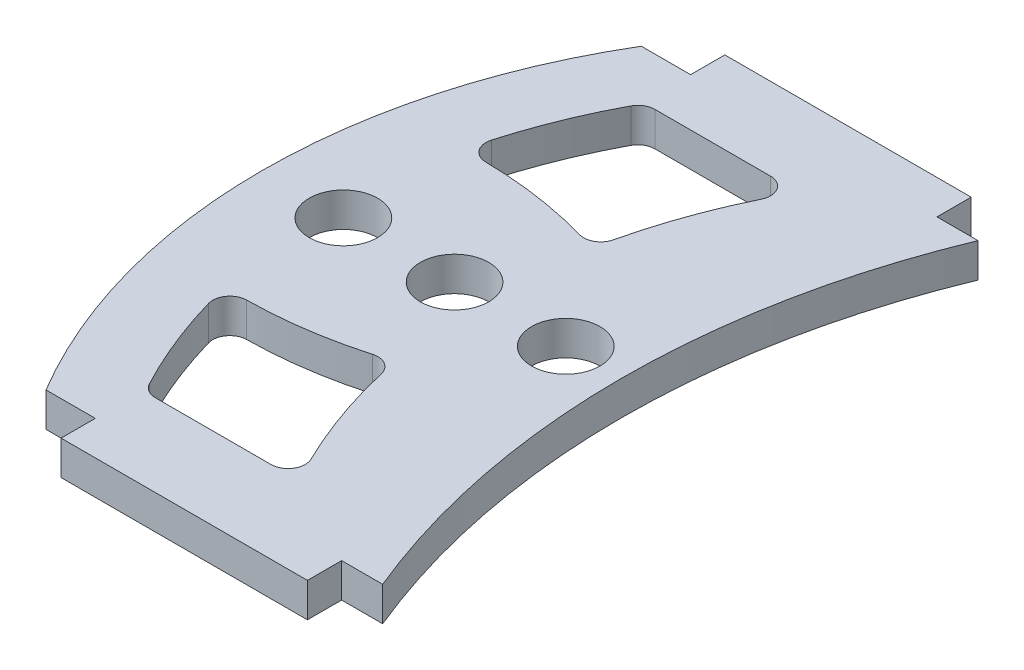
ISO-10303-21;
HEADER;
FILE_DESCRIPTION(('STEP AP214'),'2;1');
FILE_NAME('part.step','',(''),(''),'','','');
FILE_SCHEMA(('AUTOMOTIVE_DESIGN { 1 0 10303 214 1 1 1 1 }'));
ENDSEC;
DATA;
#1=APPLICATION_CONTEXT('core data for automotive mechanical design processes');
#2=APPLICATION_PROTOCOL_DEFINITION('international standard','automotive_design',2000,#1);
#3=PRODUCT_CONTEXT('',#1,'mechanical');
#4=PRODUCT('Part','Part','',(#3));
#5=PRODUCT_RELATED_PRODUCT_CATEGORY('part','',(#4));
#6=PRODUCT_DEFINITION_FORMATION('','',#4);
#7=PRODUCT_DEFINITION_CONTEXT('part definition',#1,'design');
#8=PRODUCT_DEFINITION('design','',#6,#7);
#9=PRODUCT_DEFINITION_SHAPE('','',#8);
#10=(LENGTH_UNIT() NAMED_UNIT(*) SI_UNIT(.MILLI.,.METRE.));
#11=(NAMED_UNIT(*) PLANE_ANGLE_UNIT() SI_UNIT($,.RADIAN.));
#12=(NAMED_UNIT(*) SI_UNIT($,.STERADIAN.) SOLID_ANGLE_UNIT());
#13=UNCERTAINTY_MEASURE_WITH_UNIT(LENGTH_MEASURE(1.E-05),#10,'distance_accuracy_value','');
#14=(GEOMETRIC_REPRESENTATION_CONTEXT(3) GLOBAL_UNCERTAINTY_ASSIGNED_CONTEXT((#13)) GLOBAL_UNIT_ASSIGNED_CONTEXT((#10,
#11,#12)) REPRESENTATION_CONTEXT('',''));
#15=CARTESIAN_POINT('',(0.,0.,0.));
#16=DIRECTION('',(0.,0.,1.));
#17=DIRECTION('',(1.,0.,0.));
#18=AXIS2_PLACEMENT_3D('',#15,#16,#17);
#19=CARTESIAN_POINT('',(37.1716857379459,2.,-20.9983589152019));
#20=DIRECTION('',(0.,1.,0.));
#21=DIRECTION('',(0.,0.,1.));
#22=AXIS2_PLACEMENT_3D('',#19,#20,#21);
#23=PLANE('',#22);
#24=CARTESIAN_POINT('',(7.94517783956323,2.,-20.9983589152019));
#25=DIRECTION('',(0.,1.,0.));
#26=DIRECTION('',(0.,0.,1.));
#27=AXIS2_PLACEMENT_3D('',#24,#25,#26);
#28=CIRCLE('',#27,2.);
#29=CARTESIAN_POINT('',(7.94517783956323,2.,-18.9983589152019));
#30=VERTEX_POINT('',#29);
#31=EDGE_CURVE('E349',#30,#30,#28,.T.);
#32=ORIENTED_EDGE('',*,*,#31,.F.);
#33=EDGE_LOOP('',(#32));
#34=FACE_BOUND('',#33,.T.);
#35=CARTESIAN_POINT('',(37.1716857379459,2.,-20.9983589152019));
#36=DIRECTION('',(0.,1.,0.));
#37=DIRECTION('',(0.,0.,1.));
#38=AXIS2_PLACEMENT_3D('',#35,#36,#37);
#39=CIRCLE('',#38,34.);
#40=CARTESIAN_POINT('',(7.96141357214785,2.,-38.3983589152019));
#41=VERTEX_POINT('',#40);
#42=CARTESIAN_POINT('',(7.96141357214785,2.,-3.59835891520195));
#43=VERTEX_POINT('',#42);
#44=EDGE_CURVE('E361',#41,#43,#39,.T.);
#45=ORIENTED_EDGE('',*,*,#44,.T.);
#46=DIRECTION('',(1.,0.,0.));
#47=VECTOR('',#46,1.);
#48=CARTESIAN_POINT('',(10.8429336929978,2.,-3.59835891520195));
#49=LINE('',#48,#47);
#50=CARTESIAN_POINT('',(10.8429336929978,2.,-3.59835891520195));
#51=VERTEX_POINT('',#50);
#52=EDGE_CURVE('E364',#43,#51,#49,.T.);
#53=ORIENTED_EDGE('',*,*,#52,.T.);
#54=DIRECTION('',(0.,0.,1.));
#55=VECTOR('',#54,1.);
#56=CARTESIAN_POINT('',(10.8429336929978,2.,-1.59835891520192));
#57=LINE('',#56,#55);
#58=CARTESIAN_POINT('',(10.8429336929978,2.,-1.59835891520192));
#59=VERTEX_POINT('',#58);
#60=EDGE_CURVE('E367',#51,#59,#57,.T.);
#61=ORIENTED_EDGE('',*,*,#60,.T.);
#62=DIRECTION('',(1.,0.,0.));
#63=VECTOR('',#62,1.);
#64=CARTESIAN_POINT('',(25.2429336929978,2.,-1.59835891520192));
#65=LINE('',#64,#63);
#66=CARTESIAN_POINT('',(25.2429336929978,2.,-1.59835891520192));
#67=VERTEX_POINT('',#66);
#68=EDGE_CURVE('E369',#59,#67,#65,.T.);
#69=ORIENTED_EDGE('',*,*,#68,.T.);
#70=DIRECTION('',(0.,0.,-1.));
#71=VECTOR('',#70,1.);
#72=CARTESIAN_POINT('',(25.2429336929978,2.,-3.59835891520192));
#73=LINE('',#72,#71);
#74=CARTESIAN_POINT('',(25.2429336929978,2.,-3.59835891520192));
#75=VERTEX_POINT('',#74);
#76=EDGE_CURVE('E371',#67,#75,#73,.T.);
#77=ORIENTED_EDGE('',*,*,#76,.T.);
#78=DIRECTION('',(1.,0.,0.));
#79=VECTOR('',#78,1.);
#80=CARTESIAN_POINT('',(27.6430126076578,2.,-3.59835891520195));
#81=LINE('',#80,#79);
#82=CARTESIAN_POINT('',(27.6430126076578,2.,-3.59835891520197));
#83=VERTEX_POINT('',#82);
#84=EDGE_CURVE('E373',#75,#83,#81,.T.);
#85=ORIENTED_EDGE('',*,*,#84,.T.);
#86=CARTESIAN_POINT('',(69.7927457028982,2.,-20.9983589152019));
#87=DIRECTION('',(0.,-1.,0.));
#88=DIRECTION('',(0.,0.,1.));
#89=AXIS2_PLACEMENT_3D('',#86,#87,#88);
#90=CIRCLE('',#89,45.6);
#91=CARTESIAN_POINT('',(27.6430126076579,2.,-38.398358915202));
#92=VERTEX_POINT('',#91);
#93=EDGE_CURVE('E375',#83,#92,#90,.T.);
#94=ORIENTED_EDGE('',*,*,#93,.T.);
#95=DIRECTION('',(-1.,0.,0.));
#96=VECTOR('',#95,1.);
#97=CARTESIAN_POINT('',(25.2429336929978,2.,-38.398358915202));
#98=LINE('',#97,#96);
#99=CARTESIAN_POINT('',(25.2429336929978,2.,-38.398358915202));
#100=VERTEX_POINT('',#99);
#101=EDGE_CURVE('E377',#92,#100,#98,.T.);
#102=ORIENTED_EDGE('',*,*,#101,.T.);
#103=DIRECTION('',(0.,0.,-1.));
#104=VECTOR('',#103,1.);
#105=CARTESIAN_POINT('',(25.2429336929978,2.,-40.3983589152019));
#106=LINE('',#105,#104);
#107=CARTESIAN_POINT('',(25.2429336929978,2.,-40.3983589152019));
#108=VERTEX_POINT('',#107);
#109=EDGE_CURVE('E379',#100,#108,#106,.T.);
#110=ORIENTED_EDGE('',*,*,#109,.T.);
#111=DIRECTION('',(-1.,0.,0.));
#112=VECTOR('',#111,1.);
#113=CARTESIAN_POINT('',(10.8429336929978,2.,-40.3983589152019));
#114=LINE('',#113,#112);
#115=CARTESIAN_POINT('',(10.8429336929978,2.,-40.3983589152019));
#116=VERTEX_POINT('',#115);
#117=EDGE_CURVE('E381',#108,#116,#114,.T.);
#118=ORIENTED_EDGE('',*,*,#117,.T.);
#119=DIRECTION('',(0.,0.,1.));
#120=VECTOR('',#119,1.);
#121=CARTESIAN_POINT('',(10.8429336929978,2.,-38.3983589152019));
#122=LINE('',#121,#120);
#123=CARTESIAN_POINT('',(10.8429336929978,2.,-38.3983589152019));
#124=VERTEX_POINT('',#123);
#125=EDGE_CURVE('E383',#116,#124,#122,.T.);
#126=ORIENTED_EDGE('',*,*,#125,.T.);
#127=DIRECTION('',(-1.,0.,0.));
#128=VECTOR('',#127,1.);
#129=CARTESIAN_POINT('',(7.96141357214785,2.,-38.3983589152019));
#130=LINE('',#129,#128);
#131=EDGE_CURVE('E385',#124,#41,#130,.T.);
#132=ORIENTED_EDGE('',*,*,#131,.T.);
#133=EDGE_LOOP('',(#45,#53,#61,#69,#77,#85,#94,#102,#110,#118,#126,#132));
#134=FACE_BOUND('',#133,.T.);
#135=CARTESIAN_POINT('',(14.4451778395632,2.,-20.9983589152019));
#136=DIRECTION('',(0.,1.,0.));
#137=DIRECTION('',(0.,0.,1.));
#138=AXIS2_PLACEMENT_3D('',#135,#136,#137);
#139=CIRCLE('',#138,2.);
#140=CARTESIAN_POINT('',(14.4451778395632,2.,-18.9983589152019));
#141=VERTEX_POINT('',#140);
#142=EDGE_CURVE('E355',#141,#141,#139,.T.);
#143=ORIENTED_EDGE('',*,*,#142,.F.);
#144=EDGE_LOOP('',(#143));
#145=FACE_BOUND('',#144,.T.);
#146=CARTESIAN_POINT('',(20.9451778395632,2.,-20.9983589152019));
#147=DIRECTION('',(0.,1.,0.));
#148=DIRECTION('',(0.,0.,1.));
#149=AXIS2_PLACEMENT_3D('',#146,#147,#148);
#150=CIRCLE('',#149,2.);
#151=CARTESIAN_POINT('',(20.9451778395632,2.,-18.9983589152019));
#152=VERTEX_POINT('',#151);
#153=EDGE_CURVE('E343',#152,#152,#150,.T.);
#154=ORIENTED_EDGE('',*,*,#153,.F.);
#155=EDGE_LOOP('',(#154));
#156=FACE_BOUND('',#155,.T.);
#157=CARTESIAN_POINT('',(11.5584079313083,2.,-7.39835891520193));
#158=DIRECTION('',(0.,1.,0.));
#159=DIRECTION('',(0.,0.,1.));
#160=AXIS2_PLACEMENT_3D('',#157,#158,#159);
#161=CIRCLE('',#160,1.00000000000003);
#162=CARTESIAN_POINT('',(10.6751914552173,2.,-6.92939339796053));
#163=VERTEX_POINT('',#162);
#164=CARTESIAN_POINT('',(11.5584079313083,2.,-6.3983589152019));
#165=VERTEX_POINT('',#164);
#166=EDGE_CURVE('E286',#163,#165,#161,.T.);
#167=ORIENTED_EDGE('',*,*,#166,.F.);
#168=CARTESIAN_POINT('',(37.1716857379459,2.,-20.9983589152019));
#169=DIRECTION('',(0.,1.,0.));
#170=DIRECTION('',(0.,0.,1.));
#171=AXIS2_PLACEMENT_3D('',#168,#169,#170);
#172=CIRCLE('',#171,30.);
#173=CARTESIAN_POINT('',(8.33179263701058,2.,-12.7363636400509));
#174=VERTEX_POINT('',#173);
#175=EDGE_CURVE('E284',#174,#163,#172,.T.);
#176=ORIENTED_EDGE('',*,*,#175,.F.);
#177=CARTESIAN_POINT('',(9.29312240704176,2.,-13.011763482556));
#178=DIRECTION('',(0.,1.,0.));
#179=DIRECTION('',(0.,0.,1.));
#180=AXIS2_PLACEMENT_3D('',#177,#178,#179);
#181=CIRCLE('',#180,1.);
#182=CARTESIAN_POINT('',(9.28161476425723,2.,-14.0116972674425));
#183=VERTEX_POINT('',#182);
#184=EDGE_CURVE('E300',#183,#174,#181,.T.);
#185=ORIENTED_EDGE('',*,*,#184,.F.);
#186=CARTESIAN_POINT('',(8.99980254155067,2.,-38.4992111531441));
#187=DIRECTION('',(0.,-1.,0.));
#188=DIRECTION('',(0.,0.,1.));
#189=AXIS2_PLACEMENT_3D('',#186,#187,#188);
#190=CIRCLE('',#189,24.4891354365828);
#191=CARTESIAN_POINT('',(15.7021599410508,2.,-14.9450998406649));
#192=VERTEX_POINT('',#191);
#193=EDGE_CURVE('E297',#192,#183,#190,.T.);
#194=ORIENTED_EDGE('',*,*,#193,.F.);
#195=CARTESIAN_POINT('',(15.975846916112,2.,-13.9832810221331));
#196=DIRECTION('',(0.,1.,0.));
#197=DIRECTION('',(0.,0.,1.));
#198=AXIS2_PLACEMENT_3D('',#195,#196,#197);
#199=CIRCLE('',#198,0.999999999999995);
#200=CARTESIAN_POINT('',(16.9499062329453,2.,-14.2095738573934));
#201=VERTEX_POINT('',#200);
#202=EDGE_CURVE('E295',#201,#192,#199,.T.);
#203=ORIENTED_EDGE('',*,*,#202,.F.);
#204=CARTESIAN_POINT('',(46.1716857379459,2.,-20.9983589152019));
#205=DIRECTION('',(0.,-1.,0.));
#206=DIRECTION('',(0.,0.,1.));
#207=AXIS2_PLACEMENT_3D('',#204,#205,#206);
#208=CIRCLE('',#207,30.);
#209=CARTESIAN_POINT('',(19.2128200896153,2.,-7.83706859262126));
#210=VERTEX_POINT('',#209);
#211=EDGE_CURVE('E293',#210,#201,#208,.T.);
#212=ORIENTED_EDGE('',*,*,#211,.F.);
#213=CARTESIAN_POINT('',(18.3141912346709,2.,-7.39835891520191));
#214=DIRECTION('',(0.,1.,0.));
#215=DIRECTION('',(0.,0.,1.));
#216=AXIS2_PLACEMENT_3D('',#213,#214,#215);
#217=CIRCLE('',#216,1.00000000000001);
#218=CARTESIAN_POINT('',(18.3141912346709,2.,-6.3983589152019));
#219=VERTEX_POINT('',#218);
#220=EDGE_CURVE('E291',#219,#210,#217,.T.);
#221=ORIENTED_EDGE('',*,*,#220,.F.);
#222=DIRECTION('',(1.,0.,0.));
#223=VECTOR('',#222,1.);
#224=CARTESIAN_POINT('',(11.5584079313083,2.,-6.3983589152019));
#225=LINE('',#224,#223);
#226=EDGE_CURVE('E289',#165,#219,#225,.T.);
#227=ORIENTED_EDGE('',*,*,#226,.F.);
#228=EDGE_LOOP('',(#167,#176,#185,#194,#203,#212,#221,#227));
#229=FACE_BOUND('',#228,.T.);
#230=CARTESIAN_POINT('',(37.1716857379459,2.,-20.9983589152019));
#231=DIRECTION('',(0.,1.,0.));
#232=DIRECTION('',(0.,0.,1.));
#233=AXIS2_PLACEMENT_3D('',#230,#231,#232);
#234=CIRCLE('',#233,30.);
#235=CARTESIAN_POINT('',(10.6751914552173,2.,-35.0673244324433));
#236=VERTEX_POINT('',#235);
#237=CARTESIAN_POINT('',(8.33179263701058,2.,-29.2603541903529));
#238=VERTEX_POINT('',#237);
#239=EDGE_CURVE('E227',#236,#238,#234,.T.);
#240=ORIENTED_EDGE('',*,*,#239,.F.);
#241=CARTESIAN_POINT('',(11.5584079313082,2.,-34.5983589152019));
#242=DIRECTION('',(0.,1.,0.));
#243=DIRECTION('',(0.,0.,1.));
#244=AXIS2_PLACEMENT_3D('',#241,#242,#243);
#245=CIRCLE('',#244,1.00000000000002);
#246=CARTESIAN_POINT('',(11.5584079313083,2.,-35.5983589152019));
#247=VERTEX_POINT('',#246);
#248=EDGE_CURVE('E219',#247,#236,#245,.T.);
#249=ORIENTED_EDGE('',*,*,#248,.F.);
#250=DIRECTION('',(-1.,0.,0.));
#251=VECTOR('',#250,1.);
#252=CARTESIAN_POINT('',(11.5584079313083,2.,-35.5983589152019));
#253=LINE('',#252,#251);
#254=CARTESIAN_POINT('',(18.3141912346709,2.,-35.5983589152019));
#255=VERTEX_POINT('',#254);
#256=EDGE_CURVE('E252',#255,#247,#253,.T.);
#257=ORIENTED_EDGE('',*,*,#256,.F.);
#258=CARTESIAN_POINT('',(18.3141912346709,2.,-34.5983589152019));
#259=DIRECTION('',(0.,1.,0.));
#260=DIRECTION('',(0.,0.,1.));
#261=AXIS2_PLACEMENT_3D('',#258,#259,#260);
#262=CIRCLE('',#261,1.00000000000001);
#263=CARTESIAN_POINT('',(19.2128200896153,2.,-34.1596492377826));
#264=VERTEX_POINT('',#263);
#265=EDGE_CURVE('E250',#264,#255,#262,.T.);
#266=ORIENTED_EDGE('',*,*,#265,.F.);
#267=CARTESIAN_POINT('',(46.1716857379459,2.,-20.9983589152019));
#268=DIRECTION('',(0.,-1.,0.));
#269=DIRECTION('',(0.,0.,1.));
#270=AXIS2_PLACEMENT_3D('',#267,#268,#269);
#271=CIRCLE('',#270,30.);
#272=CARTESIAN_POINT('',(16.9499062329453,2.,-27.7871439730105));
#273=VERTEX_POINT('',#272);
#274=EDGE_CURVE('E248',#273,#264,#271,.T.);
#275=ORIENTED_EDGE('',*,*,#274,.F.);
#276=CARTESIAN_POINT('',(15.975846916112,2.,-28.0134368082707));
#277=DIRECTION('',(0.,1.,0.));
#278=DIRECTION('',(0.,0.,1.));
#279=AXIS2_PLACEMENT_3D('',#276,#277,#278);
#280=CIRCLE('',#279,0.99999999999999);
#281=CARTESIAN_POINT('',(15.7021599410508,2.,-27.0516179897389));
#282=VERTEX_POINT('',#281);
#283=EDGE_CURVE('E246',#282,#273,#280,.T.);
#284=ORIENTED_EDGE('',*,*,#283,.F.);
#285=CARTESIAN_POINT('',(8.99980254155079,2.,-3.49750667725975));
#286=DIRECTION('',(0.,-1.,0.));
#287=DIRECTION('',(0.,0.,1.));
#288=AXIS2_PLACEMENT_3D('',#285,#286,#287);
#289=CIRCLE('',#288,24.4891354365828);
#290=CARTESIAN_POINT('',(9.28161476425722,2.,-27.9850205629613));
#291=VERTEX_POINT('',#290);
#292=EDGE_CURVE('E242',#291,#282,#289,.T.);
#293=ORIENTED_EDGE('',*,*,#292,.F.);
#294=CARTESIAN_POINT('',(9.29312240704176,2.,-28.9849543478479));
#295=DIRECTION('',(0.,1.,0.));
#296=DIRECTION('',(0.,0.,1.));
#297=AXIS2_PLACEMENT_3D('',#294,#295,#296);
#298=CIRCLE('',#297,1.);
#299=EDGE_CURVE('E240',#238,#291,#298,.T.);
#300=ORIENTED_EDGE('',*,*,#299,.F.);
#301=EDGE_LOOP('',(#240,#249,#257,#266,#275,#284,#293,#300));
#302=FACE_BOUND('',#301,.T.);
#303=ADVANCED_FACE('F34',(#34,#134,#145,#156,#229,#302),#23,.T.);
#304=CARTESIAN_POINT('',(37.1716857379459,0.,-20.9983589152019));
#305=DIRECTION('',(0.,1.,0.));
#306=DIRECTION('',(0.,0.,1.));
#307=AXIS2_PLACEMENT_3D('',#304,#305,#306);
#308=PLANE('',#307);
#309=CARTESIAN_POINT('',(37.1716857379459,0.,-20.9983589152019));
#310=DIRECTION('',(0.,1.,0.));
#311=DIRECTION('',(0.,0.,1.));
#312=AXIS2_PLACEMENT_3D('',#309,#310,#311);
#313=CIRCLE('',#312,30.);
#314=CARTESIAN_POINT('',(8.33179263701058,0.,-12.7363636400509));
#315=VERTEX_POINT('',#314);
#316=CARTESIAN_POINT('',(10.6751914552173,0.,-6.92939339796053));
#317=VERTEX_POINT('',#316);
#318=EDGE_CURVE('E235',#315,#317,#313,.T.);
#319=ORIENTED_EDGE('',*,*,#318,.T.);
#320=CARTESIAN_POINT('',(11.5584079313083,0.,-7.39835891520193));
#321=DIRECTION('',(0.,1.,0.));
#322=DIRECTION('',(0.,0.,1.));
#323=AXIS2_PLACEMENT_3D('',#320,#321,#322);
#324=CIRCLE('',#323,1.00000000000003);
#325=CARTESIAN_POINT('',(11.5584079313083,0.,-6.3983589152019));
#326=VERTEX_POINT('',#325);
#327=EDGE_CURVE('E305',#317,#326,#324,.T.);
#328=ORIENTED_EDGE('',*,*,#327,.T.);
#329=DIRECTION('',(1.,0.,0.));
#330=VECTOR('',#329,1.);
#331=CARTESIAN_POINT('',(11.5584079313083,0.,-6.3983589152019));
#332=LINE('',#331,#330);
#333=CARTESIAN_POINT('',(18.3141912346709,0.,-6.3983589152019));
#334=VERTEX_POINT('',#333);
#335=EDGE_CURVE('E308',#326,#334,#332,.T.);
#336=ORIENTED_EDGE('',*,*,#335,.T.);
#337=CARTESIAN_POINT('',(18.3141912346709,0.,-7.39835891520191));
#338=DIRECTION('',(0.,1.,0.));
#339=DIRECTION('',(0.,0.,1.));
#340=AXIS2_PLACEMENT_3D('',#337,#338,#339);
#341=CIRCLE('',#340,1.00000000000001);
#342=CARTESIAN_POINT('',(19.2128200896153,0.,-7.83706859262126));
#343=VERTEX_POINT('',#342);
#344=EDGE_CURVE('E311',#334,#343,#341,.T.);
#345=ORIENTED_EDGE('',*,*,#344,.T.);
#346=CARTESIAN_POINT('',(46.1716857379459,0.,-20.9983589152019));
#347=DIRECTION('',(0.,-1.,0.));
#348=DIRECTION('',(0.,0.,1.));
#349=AXIS2_PLACEMENT_3D('',#346,#347,#348);
#350=CIRCLE('',#349,30.);
#351=CARTESIAN_POINT('',(16.9499062329453,0.,-14.2095738573934));
#352=VERTEX_POINT('',#351);
#353=EDGE_CURVE('E314',#343,#352,#350,.T.);
#354=ORIENTED_EDGE('',*,*,#353,.T.);
#355=CARTESIAN_POINT('',(15.975846916112,0.,-13.9832810221331));
#356=DIRECTION('',(0.,1.,0.));
#357=DIRECTION('',(0.,0.,1.));
#358=AXIS2_PLACEMENT_3D('',#355,#356,#357);
#359=CIRCLE('',#358,0.999999999999995);
#360=CARTESIAN_POINT('',(15.7021599410508,0.,-14.9450998406649));
#361=VERTEX_POINT('',#360);
#362=EDGE_CURVE('E317',#352,#361,#359,.T.);
#363=ORIENTED_EDGE('',*,*,#362,.T.);
#364=CARTESIAN_POINT('',(8.99980254155067,0.,-38.4992111531441));
#365=DIRECTION('',(0.,-1.,0.));
#366=DIRECTION('',(0.,0.,1.));
#367=AXIS2_PLACEMENT_3D('',#364,#365,#366);
#368=CIRCLE('',#367,24.4891354365828);
#369=CARTESIAN_POINT('',(9.28161476425723,0.,-14.0116972674425));
#370=VERTEX_POINT('',#369);
#371=EDGE_CURVE('E320',#361,#370,#368,.T.);
#372=ORIENTED_EDGE('',*,*,#371,.T.);
#373=CARTESIAN_POINT('',(9.29312240704176,0.,-13.011763482556));
#374=DIRECTION('',(0.,1.,0.));
#375=DIRECTION('',(0.,0.,1.));
#376=AXIS2_PLACEMENT_3D('',#373,#374,#375);
#377=CIRCLE('',#376,1.);
#378=EDGE_CURVE('E287',#370,#315,#377,.T.);
#379=ORIENTED_EDGE('',*,*,#378,.T.);
#380=EDGE_LOOP('',(#319,#328,#336,#345,#354,#363,#372,#379));
#381=FACE_BOUND('',#380,.T.);
#382=CARTESIAN_POINT('',(37.1716857379459,0.,-20.9983589152019));
#383=DIRECTION('',(0.,1.,0.));
#384=DIRECTION('',(0.,0.,1.));
#385=AXIS2_PLACEMENT_3D('',#382,#383,#384);
#386=CIRCLE('',#385,34.);
#387=CARTESIAN_POINT('',(7.96141357214785,0.,-38.3983589152019));
#388=VERTEX_POINT('',#387);
#389=CARTESIAN_POINT('',(7.96141357214785,0.,-3.59835891520195));
#390=VERTEX_POINT('',#389);
#391=EDGE_CURVE('E358',#388,#390,#386,.T.);
#392=ORIENTED_EDGE('',*,*,#391,.F.);
#393=DIRECTION('',(-1.,0.,0.));
#394=VECTOR('',#393,1.);
#395=CARTESIAN_POINT('',(7.96141357214785,0.,-38.3983589152019));
#396=LINE('',#395,#394);
#397=CARTESIAN_POINT('',(10.8429336929978,0.,-38.3983589152019));
#398=VERTEX_POINT('',#397);
#399=EDGE_CURVE('E365',#398,#388,#396,.T.);
#400=ORIENTED_EDGE('',*,*,#399,.F.);
#401=DIRECTION('',(0.,0.,1.));
#402=VECTOR('',#401,1.);
#403=CARTESIAN_POINT('',(10.8429336929978,0.,-38.3983589152019));
#404=LINE('',#403,#402);
#405=CARTESIAN_POINT('',(10.8429336929978,0.,-40.3983589152019));
#406=VERTEX_POINT('',#405);
#407=EDGE_CURVE('E408',#406,#398,#404,.T.);
#408=ORIENTED_EDGE('',*,*,#407,.F.);
#409=DIRECTION('',(-1.,0.,0.));
#410=VECTOR('',#409,1.);
#411=CARTESIAN_POINT('',(10.8429336929978,0.,-40.3983589152019));
#412=LINE('',#411,#410);
#413=CARTESIAN_POINT('',(25.2429336929978,0.,-40.3983589152019));
#414=VERTEX_POINT('',#413);
#415=EDGE_CURVE('E406',#414,#406,#412,.T.);
#416=ORIENTED_EDGE('',*,*,#415,.F.);
#417=DIRECTION('',(0.,0.,-1.));
#418=VECTOR('',#417,1.);
#419=CARTESIAN_POINT('',(25.2429336929978,0.,-40.3983589152019));
#420=LINE('',#419,#418);
#421=CARTESIAN_POINT('',(25.2429336929978,0.,-38.398358915202));
#422=VERTEX_POINT('',#421);
#423=EDGE_CURVE('E404',#422,#414,#420,.T.);
#424=ORIENTED_EDGE('',*,*,#423,.F.);
#425=DIRECTION('',(-1.,0.,0.));
#426=VECTOR('',#425,1.);
#427=CARTESIAN_POINT('',(25.2429336929978,0.,-38.398358915202));
#428=LINE('',#427,#426);
#429=CARTESIAN_POINT('',(27.6430126076579,0.,-38.398358915202));
#430=VERTEX_POINT('',#429);
#431=EDGE_CURVE('E402',#430,#422,#428,.T.);
#432=ORIENTED_EDGE('',*,*,#431,.F.);
#433=CARTESIAN_POINT('',(69.7927457028982,0.,-20.9983589152019));
#434=DIRECTION('',(0.,-1.,0.));
#435=DIRECTION('',(0.,0.,1.));
#436=AXIS2_PLACEMENT_3D('',#433,#434,#435);
#437=CIRCLE('',#436,45.6);
#438=CARTESIAN_POINT('',(27.6430126076578,0.,-3.59835891520197));
#439=VERTEX_POINT('',#438);
#440=EDGE_CURVE('E400',#439,#430,#437,.T.);
#441=ORIENTED_EDGE('',*,*,#440,.F.);
#442=DIRECTION('',(1.,0.,0.));
#443=VECTOR('',#442,1.);
#444=CARTESIAN_POINT('',(27.6430126076578,0.,-3.59835891520195));
#445=LINE('',#444,#443);
#446=CARTESIAN_POINT('',(25.2429336929978,0.,-3.59835891520192));
#447=VERTEX_POINT('',#446);
#448=EDGE_CURVE('E398',#447,#439,#445,.T.);
#449=ORIENTED_EDGE('',*,*,#448,.F.);
#450=DIRECTION('',(0.,0.,-1.));
#451=VECTOR('',#450,1.);
#452=CARTESIAN_POINT('',(25.2429336929978,0.,-3.59835891520192));
#453=LINE('',#452,#451);
#454=CARTESIAN_POINT('',(25.2429336929978,0.,-1.59835891520192));
#455=VERTEX_POINT('',#454);
#456=EDGE_CURVE('E396',#455,#447,#453,.T.);
#457=ORIENTED_EDGE('',*,*,#456,.F.);
#458=DIRECTION('',(1.,0.,0.));
#459=VECTOR('',#458,1.);
#460=CARTESIAN_POINT('',(25.2429336929978,0.,-1.59835891520192));
#461=LINE('',#460,#459);
#462=CARTESIAN_POINT('',(10.8429336929978,0.,-1.59835891520192));
#463=VERTEX_POINT('',#462);
#464=EDGE_CURVE('E394',#463,#455,#461,.T.);
#465=ORIENTED_EDGE('',*,*,#464,.F.);
#466=DIRECTION('',(0.,0.,1.));
#467=VECTOR('',#466,1.);
#468=CARTESIAN_POINT('',(10.8429336929978,0.,-1.59835891520192));
#469=LINE('',#468,#467);
#470=CARTESIAN_POINT('',(10.8429336929978,0.,-3.59835891520195));
#471=VERTEX_POINT('',#470);
#472=EDGE_CURVE('E392',#471,#463,#469,.T.);
#473=ORIENTED_EDGE('',*,*,#472,.F.);
#474=DIRECTION('',(1.,0.,0.));
#475=VECTOR('',#474,1.);
#476=CARTESIAN_POINT('',(10.8429336929978,0.,-3.59835891520195));
#477=LINE('',#476,#475);
#478=EDGE_CURVE('E390',#390,#471,#477,.T.);
#479=ORIENTED_EDGE('',*,*,#478,.F.);
#480=EDGE_LOOP('',(#392,#400,#408,#416,#424,#432,#441,#449,#457,#465,#473,#479));
#481=FACE_BOUND('',#480,.T.);
#482=CARTESIAN_POINT('',(14.4451778395632,0.,-20.9983589152019));
#483=DIRECTION('',(0.,1.,0.));
#484=DIRECTION('',(0.,0.,1.));
#485=AXIS2_PLACEMENT_3D('',#482,#483,#484);
#486=CIRCLE('',#485,2.);
#487=CARTESIAN_POINT('',(14.4451778395632,0.,-18.9983589152019));
#488=VERTEX_POINT('',#487);
#489=EDGE_CURVE('E352',#488,#488,#486,.T.);
#490=ORIENTED_EDGE('',*,*,#489,.T.);
#491=EDGE_LOOP('',(#490));
#492=FACE_BOUND('',#491,.T.);
#493=CARTESIAN_POINT('',(7.94517783956323,0.,-20.9983589152019));
#494=DIRECTION('',(0.,1.,0.));
#495=DIRECTION('',(0.,0.,1.));
#496=AXIS2_PLACEMENT_3D('',#493,#494,#495);
#497=CIRCLE('',#496,2.);
#498=CARTESIAN_POINT('',(7.94517783956323,0.,-18.9983589152019));
#499=VERTEX_POINT('',#498);
#500=EDGE_CURVE('E346',#499,#499,#497,.T.);
#501=ORIENTED_EDGE('',*,*,#500,.T.);
#502=EDGE_LOOP('',(#501));
#503=FACE_BOUND('',#502,.T.);
#504=CARTESIAN_POINT('',(20.9451778395632,0.,-20.9983589152019));
#505=DIRECTION('',(0.,1.,0.));
#506=DIRECTION('',(0.,0.,1.));
#507=AXIS2_PLACEMENT_3D('',#504,#505,#506);
#508=CIRCLE('',#507,2.);
#509=CARTESIAN_POINT('',(20.9451778395632,0.,-18.9983589152019));
#510=VERTEX_POINT('',#509);
#511=EDGE_CURVE('E342',#510,#510,#508,.T.);
#512=ORIENTED_EDGE('',*,*,#511,.T.);
#513=EDGE_LOOP('',(#512));
#514=FACE_BOUND('',#513,.T.);
#515=CARTESIAN_POINT('',(11.5584079313082,0.,-34.5983589152019));
#516=DIRECTION('',(0.,1.,0.));
#517=DIRECTION('',(0.,0.,1.));
#518=AXIS2_PLACEMENT_3D('',#515,#516,#517);
#519=CIRCLE('',#518,1.00000000000002);
#520=CARTESIAN_POINT('',(11.5584079313083,0.,-35.5983589152019));
#521=VERTEX_POINT('',#520);
#522=CARTESIAN_POINT('',(10.6751914552173,0.,-35.0673244324433));
#523=VERTEX_POINT('',#522);
#524=EDGE_CURVE('E57',#521,#523,#519,.T.);
#525=ORIENTED_EDGE('',*,*,#524,.T.);
#526=CARTESIAN_POINT('',(37.1716857379459,0.,-20.9983589152019));
#527=DIRECTION('',(0.,1.,0.));
#528=DIRECTION('',(0.,0.,1.));
#529=AXIS2_PLACEMENT_3D('',#526,#527,#528);
#530=CIRCLE('',#529,30.);
#531=CARTESIAN_POINT('',(8.33179263701058,0.,-29.2603541903529));
#532=VERTEX_POINT('',#531);
#533=EDGE_CURVE('E234',#523,#532,#530,.T.);
#534=ORIENTED_EDGE('',*,*,#533,.T.);
#535=CARTESIAN_POINT('',(9.29312240704176,0.,-28.9849543478479));
#536=DIRECTION('',(0.,1.,0.));
#537=DIRECTION('',(0.,0.,1.));
#538=AXIS2_PLACEMENT_3D('',#535,#536,#537);
#539=CIRCLE('',#538,1.);
#540=CARTESIAN_POINT('',(9.28161476425722,0.,-27.9850205629613));
#541=VERTEX_POINT('',#540);
#542=EDGE_CURVE('E256',#532,#541,#539,.T.);
#543=ORIENTED_EDGE('',*,*,#542,.T.);
#544=CARTESIAN_POINT('',(8.99980254155079,0.,-3.49750667725975));
#545=DIRECTION('',(0.,-1.,0.));
#546=DIRECTION('',(0.,0.,1.));
#547=AXIS2_PLACEMENT_3D('',#544,#545,#546);
#548=CIRCLE('',#547,24.4891354365828);
#549=CARTESIAN_POINT('',(15.7021599410508,0.,-27.0516179897389));
#550=VERTEX_POINT('',#549);
#551=EDGE_CURVE('E259',#541,#550,#548,.T.);
#552=ORIENTED_EDGE('',*,*,#551,.T.);
#553=CARTESIAN_POINT('',(15.975846916112,0.,-28.0134368082707));
#554=DIRECTION('',(0.,1.,0.));
#555=DIRECTION('',(0.,0.,1.));
#556=AXIS2_PLACEMENT_3D('',#553,#554,#555);
#557=CIRCLE('',#556,0.99999999999999);
#558=CARTESIAN_POINT('',(16.9499062329453,0.,-27.7871439730105));
#559=VERTEX_POINT('',#558);
#560=EDGE_CURVE('E262',#550,#559,#557,.T.);
#561=ORIENTED_EDGE('',*,*,#560,.T.);
#562=CARTESIAN_POINT('',(46.1716857379459,0.,-20.9983589152019));
#563=DIRECTION('',(0.,-1.,0.));
#564=DIRECTION('',(0.,0.,1.));
#565=AXIS2_PLACEMENT_3D('',#562,#563,#564);
#566=CIRCLE('',#565,30.);
#567=CARTESIAN_POINT('',(19.2128200896153,0.,-34.1596492377826));
#568=VERTEX_POINT('',#567);
#569=EDGE_CURVE('E265',#559,#568,#566,.T.);
#570=ORIENTED_EDGE('',*,*,#569,.T.);
#571=CARTESIAN_POINT('',(18.3141912346709,0.,-34.5983589152019));
#572=DIRECTION('',(0.,1.,0.));
#573=DIRECTION('',(0.,0.,1.));
#574=AXIS2_PLACEMENT_3D('',#571,#572,#573);
#575=CIRCLE('',#574,1.00000000000001);
#576=CARTESIAN_POINT('',(18.3141912346709,0.,-35.5983589152019));
#577=VERTEX_POINT('',#576);
#578=EDGE_CURVE('E268',#568,#577,#575,.T.);
#579=ORIENTED_EDGE('',*,*,#578,.T.);
#580=DIRECTION('',(-1.,0.,0.));
#581=VECTOR('',#580,1.);
#582=CARTESIAN_POINT('',(11.5584079313083,0.,-35.5983589152019));
#583=LINE('',#582,#581);
#584=EDGE_CURVE('E228',#577,#521,#583,.T.);
#585=ORIENTED_EDGE('',*,*,#584,.T.);
#586=EDGE_LOOP('',(#525,#534,#543,#552,#561,#570,#579,#585));
#587=FACE_BOUND('',#586,.T.);
#588=ADVANCED_FACE('F450',(#381,#481,#492,#503,#514,#587),#308,.F.);
#589=CARTESIAN_POINT('',(37.1716857379459,2.,-20.9983589152019));
#590=DIRECTION('',(0.,-1.,0.));
#591=DIRECTION('',(0.,0.,-1.));
#592=AXIS2_PLACEMENT_3D('',#589,#590,#591);
#593=CYLINDRICAL_SURFACE('',#592,34.);
#594=ORIENTED_EDGE('',*,*,#391,.T.);
#595=DIRECTION('',(0.,-1.,0.));
#596=VECTOR('',#595,1.);
#597=CARTESIAN_POINT('',(7.96141357214785,2.,-3.59835891520195));
#598=LINE('',#597,#596);
#599=EDGE_CURVE('E11',#43,#390,#598,.T.);
#600=ORIENTED_EDGE('',*,*,#599,.F.);
#601=ORIENTED_EDGE('',*,*,#44,.F.);
#602=DIRECTION('',(0.,-1.,0.));
#603=VECTOR('',#602,1.);
#604=CARTESIAN_POINT('',(7.96141357214785,2.,-38.3983589152019));
#605=LINE('',#604,#603);
#606=EDGE_CURVE('E387',#41,#388,#605,.T.);
#607=ORIENTED_EDGE('',*,*,#606,.T.);
#608=EDGE_LOOP('',(#594,#600,#601,#607));
#609=FACE_BOUND('',#608,.T.);
#610=ADVANCED_FACE('F36',(#609),#593,.T.);
#611=CARTESIAN_POINT('',(10.8429336929978,2.,-3.59835891520195));
#612=DIRECTION('',(0.,0.,-1.));
#613=DIRECTION('',(-1.,0.,0.));
#614=AXIS2_PLACEMENT_3D('',#611,#612,#613);
#615=PLANE('',#614);
#616=ORIENTED_EDGE('',*,*,#478,.T.);
#617=DIRECTION('',(0.,-1.,0.));
#618=VECTOR('',#617,1.);
#619=CARTESIAN_POINT('',(10.8429336929978,2.,-3.59835891520195));
#620=LINE('',#619,#618);
#621=EDGE_CURVE('E42',#51,#471,#620,.T.);
#622=ORIENTED_EDGE('',*,*,#621,.F.);
#623=ORIENTED_EDGE('',*,*,#52,.F.);
#624=ORIENTED_EDGE('',*,*,#599,.T.);
#625=EDGE_LOOP('',(#616,#622,#623,#624));
#626=FACE_BOUND('',#625,.T.);
#627=ADVANCED_FACE('F468',(#626),#615,.F.);
#628=CARTESIAN_POINT('',(10.8429336929978,2.,-1.59835891520192));
#629=DIRECTION('',(1.,0.,0.));
#630=DIRECTION('',(0.,0.,-1.));
#631=AXIS2_PLACEMENT_3D('',#628,#629,#630);
#632=PLANE('',#631);
#633=ORIENTED_EDGE('',*,*,#472,.T.);
#634=DIRECTION('',(0.,-1.,0.));
#635=VECTOR('',#634,1.);
#636=CARTESIAN_POINT('',(10.8429336929978,2.,-1.59835891520192));
#637=LINE('',#636,#635);
#638=EDGE_CURVE('E437',#59,#463,#637,.T.);
#639=ORIENTED_EDGE('',*,*,#638,.F.);
#640=ORIENTED_EDGE('',*,*,#60,.F.);
#641=ORIENTED_EDGE('',*,*,#621,.T.);
#642=EDGE_LOOP('',(#633,#639,#640,#641));
#643=FACE_BOUND('',#642,.T.);
#644=ADVANCED_FACE('F444',(#643),#632,.F.);
#645=CARTESIAN_POINT('',(25.2429336929978,2.,-1.59835891520192));
#646=DIRECTION('',(0.,0.,-1.));
#647=DIRECTION('',(-1.,0.,0.));
#648=AXIS2_PLACEMENT_3D('',#645,#646,#647);
#649=PLANE('',#648);
#650=ORIENTED_EDGE('',*,*,#464,.T.);
#651=DIRECTION('',(0.,-1.,0.));
#652=VECTOR('',#651,1.);
#653=CARTESIAN_POINT('',(25.2429336929978,2.,-1.59835891520192));
#654=LINE('',#653,#652);
#655=EDGE_CURVE('E434',#67,#455,#654,.T.);
#656=ORIENTED_EDGE('',*,*,#655,.F.);
#657=ORIENTED_EDGE('',*,*,#68,.F.);
#658=ORIENTED_EDGE('',*,*,#638,.T.);
#659=EDGE_LOOP('',(#650,#656,#657,#658));
#660=FACE_BOUND('',#659,.T.);
#661=ADVANCED_FACE('F456',(#660),#649,.F.);
#662=CARTESIAN_POINT('',(25.2429336929978,2.,-3.59835891520192));
#663=DIRECTION('',(-1.,0.,0.));
#664=DIRECTION('',(0.,0.,1.));
#665=AXIS2_PLACEMENT_3D('',#662,#663,#664);
#666=PLANE('',#665);
#667=ORIENTED_EDGE('',*,*,#456,.T.);
#668=DIRECTION('',(0.,-1.,0.));
#669=VECTOR('',#668,1.);
#670=CARTESIAN_POINT('',(25.2429336929978,2.,-3.59835891520192));
#671=LINE('',#670,#669);
#672=EDGE_CURVE('E431',#75,#447,#671,.T.);
#673=ORIENTED_EDGE('',*,*,#672,.F.);
#674=ORIENTED_EDGE('',*,*,#76,.F.);
#675=ORIENTED_EDGE('',*,*,#655,.T.);
#676=EDGE_LOOP('',(#667,#673,#674,#675));
#677=FACE_BOUND('',#676,.T.);
#678=ADVANCED_FACE('F460',(#677),#666,.F.);
#679=CARTESIAN_POINT('',(27.6430126076578,2.,-3.59835891520195));
#680=DIRECTION('',(0.,0.,-1.));
#681=DIRECTION('',(-1.,0.,0.));
#682=AXIS2_PLACEMENT_3D('',#679,#680,#681);
#683=PLANE('',#682);
#684=ORIENTED_EDGE('',*,*,#448,.T.);
#685=DIRECTION('',(0.,-1.,0.));
#686=VECTOR('',#685,1.);
#687=CARTESIAN_POINT('',(27.6430126076578,2.,-3.59835891520197));
#688=LINE('',#687,#686);
#689=EDGE_CURVE('E428',#83,#439,#688,.T.);
#690=ORIENTED_EDGE('',*,*,#689,.F.);
#691=ORIENTED_EDGE('',*,*,#84,.F.);
#692=ORIENTED_EDGE('',*,*,#672,.T.);
#693=EDGE_LOOP('',(#684,#690,#691,#692));
#694=FACE_BOUND('',#693,.T.);
#695=ADVANCED_FACE('F501',(#694),#683,.F.);
#696=CARTESIAN_POINT('',(69.7927457028982,2.,-20.9983589152019));
#697=DIRECTION('',(0.,-1.,0.));
#698=DIRECTION('',(0.,0.,-1.));
#699=AXIS2_PLACEMENT_3D('',#696,#697,#698);
#700=CYLINDRICAL_SURFACE('',#699,45.6);
#701=ORIENTED_EDGE('',*,*,#440,.T.);
#702=DIRECTION('',(0.,-1.,0.));
#703=VECTOR('',#702,1.);
#704=CARTESIAN_POINT('',(27.6430126076579,2.,-38.398358915202));
#705=LINE('',#704,#703);
#706=EDGE_CURVE('E425',#92,#430,#705,.T.);
#707=ORIENTED_EDGE('',*,*,#706,.F.);
#708=ORIENTED_EDGE('',*,*,#93,.F.);
#709=ORIENTED_EDGE('',*,*,#689,.T.);
#710=EDGE_LOOP('',(#701,#707,#708,#709));
#711=FACE_BOUND('',#710,.T.);
#712=ADVANCED_FACE('F499',(#711),#700,.F.);
#713=CARTESIAN_POINT('',(25.2429336929978,2.,-38.398358915202));
#714=DIRECTION('',(0.,0.,1.));
#715=DIRECTION('',(1.,0.,0.));
#716=AXIS2_PLACEMENT_3D('',#713,#714,#715);
#717=PLANE('',#716);
#718=ORIENTED_EDGE('',*,*,#431,.T.);
#719=DIRECTION('',(0.,-1.,0.));
#720=VECTOR('',#719,1.);
#721=CARTESIAN_POINT('',(25.2429336929978,2.,-38.398358915202));
#722=LINE('',#721,#720);
#723=EDGE_CURVE('E422',#100,#422,#722,.T.);
#724=ORIENTED_EDGE('',*,*,#723,.F.);
#725=ORIENTED_EDGE('',*,*,#101,.F.);
#726=ORIENTED_EDGE('',*,*,#706,.T.);
#727=EDGE_LOOP('',(#718,#724,#725,#726));
#728=FACE_BOUND('',#727,.T.);
#729=ADVANCED_FACE('F495',(#728),#717,.F.);
#730=CARTESIAN_POINT('',(25.2429336929978,2.,-40.3983589152019));
#731=DIRECTION('',(-1.,0.,0.));
#732=DIRECTION('',(0.,0.,1.));
#733=AXIS2_PLACEMENT_3D('',#730,#731,#732);
#734=PLANE('',#733);
#735=ORIENTED_EDGE('',*,*,#423,.T.);
#736=DIRECTION('',(0.,-1.,0.));
#737=VECTOR('',#736,1.);
#738=CARTESIAN_POINT('',(25.2429336929978,2.,-40.3983589152019));
#739=LINE('',#738,#737);
#740=EDGE_CURVE('E419',#108,#414,#739,.T.);
#741=ORIENTED_EDGE('',*,*,#740,.F.);
#742=ORIENTED_EDGE('',*,*,#109,.F.);
#743=ORIENTED_EDGE('',*,*,#723,.T.);
#744=EDGE_LOOP('',(#735,#741,#742,#743));
#745=FACE_BOUND('',#744,.T.);
#746=ADVANCED_FACE('F490',(#745),#734,.F.);
#747=CARTESIAN_POINT('',(10.8429336929978,2.,-40.3983589152019));
#748=DIRECTION('',(0.,0.,1.));
#749=DIRECTION('',(1.,0.,0.));
#750=AXIS2_PLACEMENT_3D('',#747,#748,#749);
#751=PLANE('',#750);
#752=ORIENTED_EDGE('',*,*,#415,.T.);
#753=DIRECTION('',(0.,-1.,0.));
#754=VECTOR('',#753,1.);
#755=CARTESIAN_POINT('',(10.8429336929978,2.,-40.3983589152019));
#756=LINE('',#755,#754);
#757=EDGE_CURVE('E416',#116,#406,#756,.T.);
#758=ORIENTED_EDGE('',*,*,#757,.F.);
#759=ORIENTED_EDGE('',*,*,#117,.F.);
#760=ORIENTED_EDGE('',*,*,#740,.T.);
#761=EDGE_LOOP('',(#752,#758,#759,#760));
#762=FACE_BOUND('',#761,.T.);
#763=ADVANCED_FACE('F484',(#762),#751,.F.);
#764=CARTESIAN_POINT('',(10.8429336929978,2.,-38.3983589152019));
#765=DIRECTION('',(1.,0.,0.));
#766=DIRECTION('',(0.,0.,-1.));
#767=AXIS2_PLACEMENT_3D('',#764,#765,#766);
#768=PLANE('',#767);
#769=ORIENTED_EDGE('',*,*,#407,.T.);
#770=DIRECTION('',(0.,-1.,0.));
#771=VECTOR('',#770,1.);
#772=CARTESIAN_POINT('',(10.8429336929978,2.,-38.3983589152019));
#773=LINE('',#772,#771);
#774=EDGE_CURVE('E413',#124,#398,#773,.T.);
#775=ORIENTED_EDGE('',*,*,#774,.F.);
#776=ORIENTED_EDGE('',*,*,#125,.F.);
#777=ORIENTED_EDGE('',*,*,#757,.T.);
#778=EDGE_LOOP('',(#769,#775,#776,#777));
#779=FACE_BOUND('',#778,.T.);
#780=ADVANCED_FACE('F480',(#779),#768,.F.);
#781=CARTESIAN_POINT('',(7.96141357214785,2.,-38.3983589152019));
#782=DIRECTION('',(0.,0.,1.));
#783=DIRECTION('',(1.,0.,0.));
#784=AXIS2_PLACEMENT_3D('',#781,#782,#783);
#785=PLANE('',#784);
#786=ORIENTED_EDGE('',*,*,#399,.T.);
#787=ORIENTED_EDGE('',*,*,#606,.F.);
#788=ORIENTED_EDGE('',*,*,#131,.F.);
#789=ORIENTED_EDGE('',*,*,#774,.T.);
#790=EDGE_LOOP('',(#786,#787,#788,#789));
#791=FACE_BOUND('',#790,.T.);
#792=ADVANCED_FACE('F475',(#791),#785,.F.);
#793=CARTESIAN_POINT('',(14.4451778395632,2.,-20.9983589152019));
#794=DIRECTION('',(0.,-1.,0.));
#795=DIRECTION('',(0.,0.,-1.));
#796=AXIS2_PLACEMENT_3D('',#793,#794,#795);
#797=CYLINDRICAL_SURFACE('',#796,2.);
#798=ORIENTED_EDGE('',*,*,#142,.T.);
#799=EDGE_LOOP('',(#798));
#800=FACE_BOUND('',#799,.T.);
#801=ORIENTED_EDGE('',*,*,#489,.F.);
#802=EDGE_LOOP('',(#801));
#803=FACE_BOUND('',#802,.T.);
#804=ADVANCED_FACE('F520',(#800,#803),#797,.F.);
#805=CARTESIAN_POINT('',(7.94517783956323,2.,-20.9983589152019));
#806=DIRECTION('',(0.,-1.,0.));
#807=DIRECTION('',(0.,0.,-1.));
#808=AXIS2_PLACEMENT_3D('',#805,#806,#807);
#809=CYLINDRICAL_SURFACE('',#808,2.);
#810=ORIENTED_EDGE('',*,*,#31,.T.);
#811=EDGE_LOOP('',(#810));
#812=FACE_BOUND('',#811,.T.);
#813=ORIENTED_EDGE('',*,*,#500,.F.);
#814=EDGE_LOOP('',(#813));
#815=FACE_BOUND('',#814,.T.);
#816=ADVANCED_FACE('F558',(#812,#815),#809,.F.);
#817=CARTESIAN_POINT('',(20.9451778395632,2.,-20.9983589152019));
#818=DIRECTION('',(0.,-1.,0.));
#819=DIRECTION('',(0.,0.,-1.));
#820=AXIS2_PLACEMENT_3D('',#817,#818,#819);
#821=CYLINDRICAL_SURFACE('',#820,2.);
#822=ORIENTED_EDGE('',*,*,#153,.T.);
#823=EDGE_LOOP('',(#822));
#824=FACE_BOUND('',#823,.T.);
#825=ORIENTED_EDGE('',*,*,#511,.F.);
#826=EDGE_LOOP('',(#825));
#827=FACE_BOUND('',#826,.T.);
#828=ADVANCED_FACE('F565',(#824,#827),#821,.F.);
#829=CARTESIAN_POINT('',(37.1716857379459,2.,-20.9983589152019));
#830=DIRECTION('',(0.,-1.,0.));
#831=DIRECTION('',(0.,0.,-1.));
#832=AXIS2_PLACEMENT_3D('',#829,#830,#831);
#833=CYLINDRICAL_SURFACE('',#832,30.);
#834=ORIENTED_EDGE('',*,*,#318,.F.);
#835=DIRECTION('',(0.,-1.,0.));
#836=VECTOR('',#835,1.);
#837=CARTESIAN_POINT('',(8.33179263701058,2.,-12.7363636400509));
#838=LINE('',#837,#836);
#839=EDGE_CURVE('E302',#174,#315,#838,.T.);
#840=ORIENTED_EDGE('',*,*,#839,.F.);
#841=ORIENTED_EDGE('',*,*,#175,.T.);
#842=DIRECTION('',(0.,-1.,0.));
#843=VECTOR('',#842,1.);
#844=CARTESIAN_POINT('',(10.6751914552173,2.,-6.92939339796053));
#845=LINE('',#844,#843);
#846=EDGE_CURVE('E339',#163,#317,#845,.T.);
#847=ORIENTED_EDGE('',*,*,#846,.T.);
#848=EDGE_LOOP('',(#834,#840,#841,#847));
#849=FACE_BOUND('',#848,.T.);
#850=ADVANCED_FACE('F572',(#849),#833,.F.);
#851=CARTESIAN_POINT('',(11.5584079313083,2.,-7.39835891520193));
#852=DIRECTION('',(0.,-1.,0.));
#853=DIRECTION('',(0.,0.,-1.));
#854=AXIS2_PLACEMENT_3D('',#851,#852,#853);
#855=CYLINDRICAL_SURFACE('',#854,1.00000000000003);
#856=ORIENTED_EDGE('',*,*,#327,.F.);
#857=ORIENTED_EDGE('',*,*,#846,.F.);
#858=ORIENTED_EDGE('',*,*,#166,.T.);
#859=DIRECTION('',(0.,-1.,0.));
#860=VECTOR('',#859,1.);
#861=CARTESIAN_POINT('',(11.5584079313083,2.,-6.3983589152019));
#862=LINE('',#861,#860);
#863=EDGE_CURVE('E337',#165,#326,#862,.T.);
#864=ORIENTED_EDGE('',*,*,#863,.T.);
#865=EDGE_LOOP('',(#856,#857,#858,#864));
#866=FACE_BOUND('',#865,.T.);
#867=ADVANCED_FACE('F580',(#866),#855,.F.);
#868=CARTESIAN_POINT('',(11.5584079313083,2.,-6.3983589152019));
#869=DIRECTION('',(0.,0.,-1.));
#870=DIRECTION('',(-1.,0.,0.));
#871=AXIS2_PLACEMENT_3D('',#868,#869,#870);
#872=PLANE('',#871);
#873=ORIENTED_EDGE('',*,*,#335,.F.);
#874=ORIENTED_EDGE('',*,*,#863,.F.);
#875=ORIENTED_EDGE('',*,*,#226,.T.);
#876=DIRECTION('',(0.,-1.,0.));
#877=VECTOR('',#876,1.);
#878=CARTESIAN_POINT('',(18.3141912346709,2.,-6.3983589152019));
#879=LINE('',#878,#877);
#880=EDGE_CURVE('E335',#219,#334,#879,.T.);
#881=ORIENTED_EDGE('',*,*,#880,.T.);
#882=EDGE_LOOP('',(#873,#874,#875,#881));
#883=FACE_BOUND('',#882,.T.);
#884=ADVANCED_FACE('F588',(#883),#872,.T.);
#885=CARTESIAN_POINT('',(18.3141912346709,2.,-7.39835891520191));
#886=DIRECTION('',(0.,-1.,0.));
#887=DIRECTION('',(0.,0.,-1.));
#888=AXIS2_PLACEMENT_3D('',#885,#886,#887);
#889=CYLINDRICAL_SURFACE('',#888,1.00000000000001);
#890=ORIENTED_EDGE('',*,*,#344,.F.);
#891=ORIENTED_EDGE('',*,*,#880,.F.);
#892=ORIENTED_EDGE('',*,*,#220,.T.);
#893=DIRECTION('',(0.,-1.,0.));
#894=VECTOR('',#893,1.);
#895=CARTESIAN_POINT('',(19.2128200896153,2.,-7.83706859262126));
#896=LINE('',#895,#894);
#897=EDGE_CURVE('E333',#210,#343,#896,.T.);
#898=ORIENTED_EDGE('',*,*,#897,.T.);
#899=EDGE_LOOP('',(#890,#891,#892,#898));
#900=FACE_BOUND('',#899,.T.);
#901=ADVANCED_FACE('F596',(#900),#889,.F.);
#902=CARTESIAN_POINT('',(46.1716857379459,2.,-20.9983589152019));
#903=DIRECTION('',(0.,-1.,0.));
#904=DIRECTION('',(0.,0.,-1.));
#905=AXIS2_PLACEMENT_3D('',#902,#903,#904);
#906=CYLINDRICAL_SURFACE('',#905,30.);
#907=ORIENTED_EDGE('',*,*,#353,.F.);
#908=ORIENTED_EDGE('',*,*,#897,.F.);
#909=ORIENTED_EDGE('',*,*,#211,.T.);
#910=DIRECTION('',(0.,-1.,0.));
#911=VECTOR('',#910,1.);
#912=CARTESIAN_POINT('',(16.9499062329453,2.,-14.2095738573934));
#913=LINE('',#912,#911);
#914=EDGE_CURVE('E331',#201,#352,#913,.T.);
#915=ORIENTED_EDGE('',*,*,#914,.T.);
#916=EDGE_LOOP('',(#907,#908,#909,#915));
#917=FACE_BOUND('',#916,.T.);
#918=ADVANCED_FACE('F604',(#917),#906,.T.);
#919=CARTESIAN_POINT('',(15.975846916112,2.,-13.9832810221331));
#920=DIRECTION('',(0.,-1.,0.));
#921=DIRECTION('',(0.,0.,-1.));
#922=AXIS2_PLACEMENT_3D('',#919,#920,#921);
#923=CYLINDRICAL_SURFACE('',#922,0.999999999999995);
#924=ORIENTED_EDGE('',*,*,#362,.F.);
#925=ORIENTED_EDGE('',*,*,#914,.F.);
#926=ORIENTED_EDGE('',*,*,#202,.T.);
#927=DIRECTION('',(0.,-1.,0.));
#928=VECTOR('',#927,1.);
#929=CARTESIAN_POINT('',(15.7021599410508,2.,-14.9450998406649));
#930=LINE('',#929,#928);
#931=EDGE_CURVE('E329',#192,#361,#930,.T.);
#932=ORIENTED_EDGE('',*,*,#931,.T.);
#933=EDGE_LOOP('',(#924,#925,#926,#932));
#934=FACE_BOUND('',#933,.T.);
#935=ADVANCED_FACE('F612',(#934),#923,.F.);
#936=CARTESIAN_POINT('',(8.99980254155067,2.,-38.4992111531441));
#937=DIRECTION('',(0.,-1.,0.));
#938=DIRECTION('',(0.,0.,-1.));
#939=AXIS2_PLACEMENT_3D('',#936,#937,#938);
#940=CYLINDRICAL_SURFACE('',#939,24.4891354365828);
#941=ORIENTED_EDGE('',*,*,#371,.F.);
#942=ORIENTED_EDGE('',*,*,#931,.F.);
#943=ORIENTED_EDGE('',*,*,#193,.T.);
#944=DIRECTION('',(0.,-1.,0.));
#945=VECTOR('',#944,1.);
#946=CARTESIAN_POINT('',(9.28161476425723,2.,-14.0116972674425));
#947=LINE('',#946,#945);
#948=EDGE_CURVE('E327',#183,#370,#947,.T.);
#949=ORIENTED_EDGE('',*,*,#948,.T.);
#950=EDGE_LOOP('',(#941,#942,#943,#949));
#951=FACE_BOUND('',#950,.T.);
#952=ADVANCED_FACE('F620',(#951),#940,.T.);
#953=CARTESIAN_POINT('',(9.29312240704176,2.,-13.011763482556));
#954=DIRECTION('',(0.,-1.,0.));
#955=DIRECTION('',(0.,0.,-1.));
#956=AXIS2_PLACEMENT_3D('',#953,#954,#955);
#957=CYLINDRICAL_SURFACE('',#956,1.);
#958=ORIENTED_EDGE('',*,*,#378,.F.);
#959=ORIENTED_EDGE('',*,*,#948,.F.);
#960=ORIENTED_EDGE('',*,*,#184,.T.);
#961=ORIENTED_EDGE('',*,*,#839,.T.);
#962=EDGE_LOOP('',(#958,#959,#960,#961));
#963=FACE_BOUND('',#962,.T.);
#964=ADVANCED_FACE('F628',(#963),#957,.F.);
#965=CARTESIAN_POINT('',(11.5584079313082,2.,-34.5983589152019));
#966=DIRECTION('',(0.,-1.,0.));
#967=DIRECTION('',(0.,0.,-1.));
#968=AXIS2_PLACEMENT_3D('',#965,#966,#967);
#969=CYLINDRICAL_SURFACE('',#968,1.00000000000002);
#970=ORIENTED_EDGE('',*,*,#524,.F.);
#971=DIRECTION('',(0.,-1.,0.));
#972=VECTOR('',#971,1.);
#973=CARTESIAN_POINT('',(11.5584079313083,2.,-35.5983589152019));
#974=LINE('',#973,#972);
#975=EDGE_CURVE('E223',#247,#521,#974,.T.);
#976=ORIENTED_EDGE('',*,*,#975,.F.);
#977=ORIENTED_EDGE('',*,*,#248,.T.);
#978=DIRECTION('',(0.,-1.,0.));
#979=VECTOR('',#978,1.);
#980=CARTESIAN_POINT('',(10.6751914552173,2.,-35.0673244324433));
#981=LINE('',#980,#979);
#982=EDGE_CURVE('E222',#236,#523,#981,.T.);
#983=ORIENTED_EDGE('',*,*,#982,.T.);
#984=EDGE_LOOP('',(#970,#976,#977,#983));
#985=FACE_BOUND('',#984,.T.);
#986=ADVANCED_FACE('F221',(#985),#969,.F.);
#987=CARTESIAN_POINT('',(37.1716857379459,2.,-20.9983589152019));
#988=DIRECTION('',(0.,-1.,0.));
#989=DIRECTION('',(0.,0.,-1.));
#990=AXIS2_PLACEMENT_3D('',#987,#988,#989);
#991=CYLINDRICAL_SURFACE('',#990,30.);
#992=ORIENTED_EDGE('',*,*,#533,.F.);
#993=ORIENTED_EDGE('',*,*,#982,.F.);
#994=ORIENTED_EDGE('',*,*,#239,.T.);
#995=DIRECTION('',(0.,-1.,0.));
#996=VECTOR('',#995,1.);
#997=CARTESIAN_POINT('',(8.33179263701058,2.,-29.2603541903529));
#998=LINE('',#997,#996);
#999=EDGE_CURVE('E236',#238,#532,#998,.T.);
#1000=ORIENTED_EDGE('',*,*,#999,.T.);
#1001=EDGE_LOOP('',(#992,#993,#994,#1000));
#1002=FACE_BOUND('',#1001,.T.);
#1003=ADVANCED_FACE('F231',(#1002),#991,.F.);
#1004=CARTESIAN_POINT('',(9.29312240704176,2.,-28.9849543478479));
#1005=DIRECTION('',(0.,-1.,0.));
#1006=DIRECTION('',(0.,0.,-1.));
#1007=AXIS2_PLACEMENT_3D('',#1004,#1005,#1006);
#1008=CYLINDRICAL_SURFACE('',#1007,1.);
#1009=ORIENTED_EDGE('',*,*,#542,.F.);
#1010=ORIENTED_EDGE('',*,*,#999,.F.);
#1011=ORIENTED_EDGE('',*,*,#299,.T.);
#1012=DIRECTION('',(0.,-1.,0.));
#1013=VECTOR('',#1012,1.);
#1014=CARTESIAN_POINT('',(9.28161476425722,2.,-27.9850205629613));
#1015=LINE('',#1014,#1013);
#1016=EDGE_CURVE('E281',#291,#541,#1015,.T.);
#1017=ORIENTED_EDGE('',*,*,#1016,.T.);
#1018=EDGE_LOOP('',(#1009,#1010,#1011,#1017));
#1019=FACE_BOUND('',#1018,.T.);
#1020=ADVANCED_FACE('F649',(#1019),#1008,.F.);
#1021=CARTESIAN_POINT('',(8.99980254155079,2.,-3.49750667725975));
#1022=DIRECTION('',(0.,-1.,0.));
#1023=DIRECTION('',(0.,0.,-1.));
#1024=AXIS2_PLACEMENT_3D('',#1021,#1022,#1023);
#1025=CYLINDRICAL_SURFACE('',#1024,24.4891354365828);
#1026=ORIENTED_EDGE('',*,*,#551,.F.);
#1027=ORIENTED_EDGE('',*,*,#1016,.F.);
#1028=ORIENTED_EDGE('',*,*,#292,.T.);
#1029=DIRECTION('',(0.,-1.,0.));
#1030=VECTOR('',#1029,1.);
#1031=CARTESIAN_POINT('',(15.7021599410508,2.,-27.0516179897389));
#1032=LINE('',#1031,#1030);
#1033=EDGE_CURVE('E279',#282,#550,#1032,.T.);
#1034=ORIENTED_EDGE('',*,*,#1033,.T.);
#1035=EDGE_LOOP('',(#1026,#1027,#1028,#1034));
#1036=FACE_BOUND('',#1035,.T.);
#1037=ADVANCED_FACE('F656',(#1036),#1025,.T.);
#1038=CARTESIAN_POINT('',(15.975846916112,2.,-28.0134368082707));
#1039=DIRECTION('',(0.,-1.,0.));
#1040=DIRECTION('',(0.,0.,-1.));
#1041=AXIS2_PLACEMENT_3D('',#1038,#1039,#1040);
#1042=CYLINDRICAL_SURFACE('',#1041,0.99999999999999);
#1043=ORIENTED_EDGE('',*,*,#560,.F.);
#1044=ORIENTED_EDGE('',*,*,#1033,.F.);
#1045=ORIENTED_EDGE('',*,*,#283,.T.);
#1046=DIRECTION('',(0.,-1.,0.));
#1047=VECTOR('',#1046,1.);
#1048=CARTESIAN_POINT('',(16.9499062329453,2.,-27.7871439730105));
#1049=LINE('',#1048,#1047);
#1050=EDGE_CURVE('E277',#273,#559,#1049,.T.);
#1051=ORIENTED_EDGE('',*,*,#1050,.T.);
#1052=EDGE_LOOP('',(#1043,#1044,#1045,#1051));
#1053=FACE_BOUND('',#1052,.T.);
#1054=ADVANCED_FACE('F664',(#1053),#1042,.F.);
#1055=CARTESIAN_POINT('',(46.1716857379459,2.,-20.9983589152019));
#1056=DIRECTION('',(0.,-1.,0.));
#1057=DIRECTION('',(0.,0.,-1.));
#1058=AXIS2_PLACEMENT_3D('',#1055,#1056,#1057);
#1059=CYLINDRICAL_SURFACE('',#1058,30.);
#1060=ORIENTED_EDGE('',*,*,#569,.F.);
#1061=ORIENTED_EDGE('',*,*,#1050,.F.);
#1062=ORIENTED_EDGE('',*,*,#274,.T.);
#1063=DIRECTION('',(0.,-1.,0.));
#1064=VECTOR('',#1063,1.);
#1065=CARTESIAN_POINT('',(19.2128200896153,2.,-34.1596492377826));
#1066=LINE('',#1065,#1064);
#1067=EDGE_CURVE('E275',#264,#568,#1066,.T.);
#1068=ORIENTED_EDGE('',*,*,#1067,.T.);
#1069=EDGE_LOOP('',(#1060,#1061,#1062,#1068));
#1070=FACE_BOUND('',#1069,.T.);
#1071=ADVANCED_FACE('F672',(#1070),#1059,.T.);
#1072=CARTESIAN_POINT('',(18.3141912346709,2.,-34.5983589152019));
#1073=DIRECTION('',(0.,-1.,0.));
#1074=DIRECTION('',(0.,0.,-1.));
#1075=AXIS2_PLACEMENT_3D('',#1072,#1073,#1074);
#1076=CYLINDRICAL_SURFACE('',#1075,1.00000000000001);
#1077=ORIENTED_EDGE('',*,*,#578,.F.);
#1078=ORIENTED_EDGE('',*,*,#1067,.F.);
#1079=ORIENTED_EDGE('',*,*,#265,.T.);
#1080=DIRECTION('',(0.,-1.,0.));
#1081=VECTOR('',#1080,1.);
#1082=CARTESIAN_POINT('',(18.3141912346709,2.,-35.5983589152019));
#1083=LINE('',#1082,#1081);
#1084=EDGE_CURVE('E49',#255,#577,#1083,.T.);
#1085=ORIENTED_EDGE('',*,*,#1084,.T.);
#1086=EDGE_LOOP('',(#1077,#1078,#1079,#1085));
#1087=FACE_BOUND('',#1086,.T.);
#1088=ADVANCED_FACE('F680',(#1087),#1076,.F.);
#1089=CARTESIAN_POINT('',(11.5584079313083,2.,-35.5983589152019));
#1090=DIRECTION('',(0.,0.,1.));
#1091=DIRECTION('',(1.,0.,0.));
#1092=AXIS2_PLACEMENT_3D('',#1089,#1090,#1091);
#1093=PLANE('',#1092);
#1094=ORIENTED_EDGE('',*,*,#584,.F.);
#1095=ORIENTED_EDGE('',*,*,#1084,.F.);
#1096=ORIENTED_EDGE('',*,*,#256,.T.);
#1097=ORIENTED_EDGE('',*,*,#975,.T.);
#1098=EDGE_LOOP('',(#1094,#1095,#1096,#1097));
#1099=FACE_BOUND('',#1098,.T.);
#1100=ADVANCED_FACE('F688',(#1099),#1093,.T.);
#1101=CLOSED_SHELL('',(#303,#588,#610,#627,#644,#661,#678,#695,#712,#729,#746,#763,#780,#792,
#804,#816,#828,#850,#867,#884,#901,#918,#935,#952,#964,#986,#1003,#1020,#1037,#1054,#1071,#1088,#1100));
#1102=MANIFOLD_SOLID_BREP('B2',#1101);
#1103=ADVANCED_BREP_SHAPE_REPRESENTATION('',(#18,#1102),#14);
#1104=SHAPE_DEFINITION_REPRESENTATION(#9,#1103);
ENDSEC;
END-ISO-10303-21;
